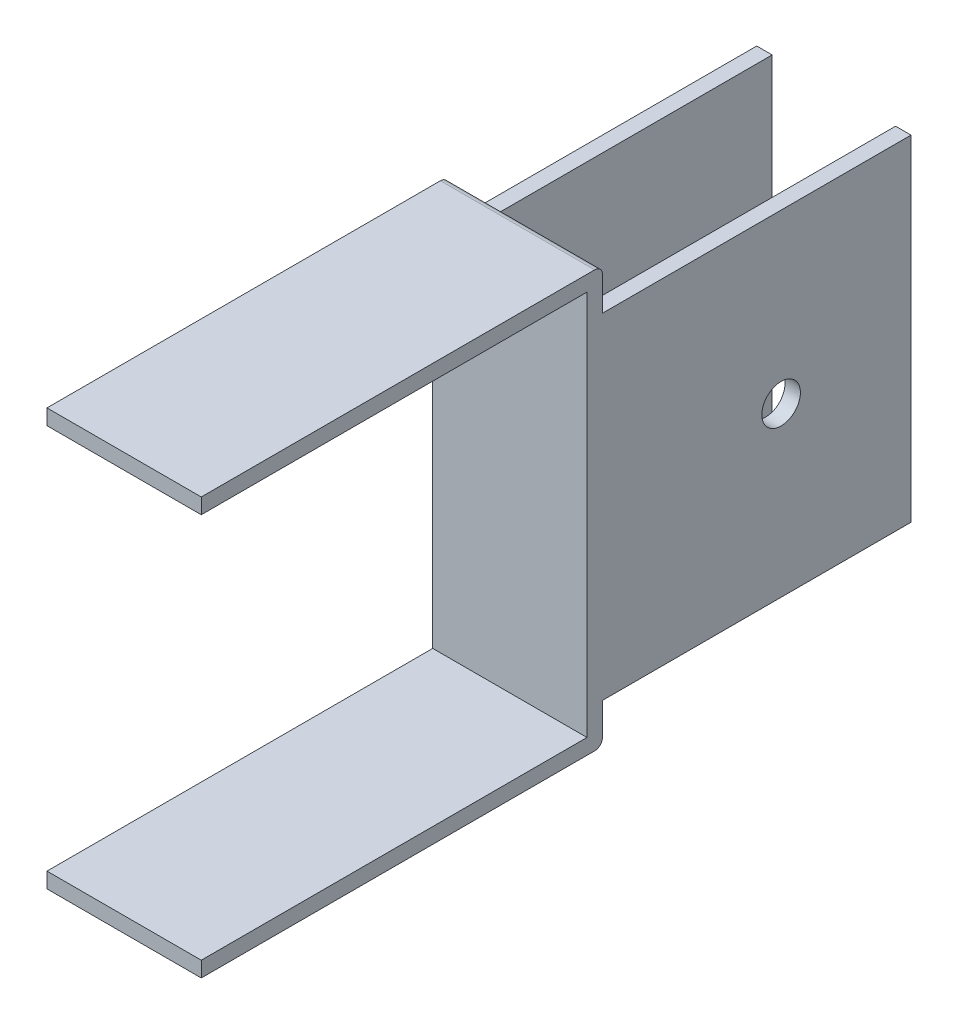
ISO-10303-21;
HEADER;
FILE_DESCRIPTION(('STEP AP214'),'2;1');
FILE_NAME('part.step','',(''),(''),'','','');
FILE_SCHEMA(('AUTOMOTIVE_DESIGN { 1 0 10303 214 1 1 1 1 }'));
ENDSEC;
DATA;
#1=APPLICATION_CONTEXT('core data for automotive mechanical design processes');
#2=APPLICATION_PROTOCOL_DEFINITION('international standard','automotive_design',2000,#1);
#3=PRODUCT_CONTEXT('',#1,'mechanical');
#4=PRODUCT('Part','Part','',(#3));
#5=PRODUCT_RELATED_PRODUCT_CATEGORY('part','',(#4));
#6=PRODUCT_DEFINITION_FORMATION('','',#4);
#7=PRODUCT_DEFINITION_CONTEXT('part definition',#1,'design');
#8=PRODUCT_DEFINITION('design','',#6,#7);
#9=PRODUCT_DEFINITION_SHAPE('','',#8);
#10=(LENGTH_UNIT() NAMED_UNIT(*) SI_UNIT(.MILLI.,.METRE.));
#11=(NAMED_UNIT(*) PLANE_ANGLE_UNIT() SI_UNIT($,.RADIAN.));
#12=(NAMED_UNIT(*) SI_UNIT($,.STERADIAN.) SOLID_ANGLE_UNIT());
#13=UNCERTAINTY_MEASURE_WITH_UNIT(LENGTH_MEASURE(1.E-05),#10,'distance_accuracy_value','');
#14=(GEOMETRIC_REPRESENTATION_CONTEXT(3) GLOBAL_UNCERTAINTY_ASSIGNED_CONTEXT((#13)) GLOBAL_UNIT_ASSIGNED_CONTEXT((#10,
#11,#12)) REPRESENTATION_CONTEXT('',''));
#15=CARTESIAN_POINT('',(0.,0.,0.));
#16=DIRECTION('',(0.,0.,1.));
#17=DIRECTION('',(1.,0.,0.));
#18=AXIS2_PLACEMENT_3D('',#15,#16,#17);
#19=CARTESIAN_POINT('',(0.,0.,0.));
#20=DIRECTION('',(0.,0.,-1.));
#21=DIRECTION('',(-1.,0.,0.));
#22=AXIS2_PLACEMENT_3D('',#19,#20,#21);
#23=PLANE('',#22);
#24=DIRECTION('',(0.,-1.,0.));
#25=VECTOR('',#24,1.);
#26=CARTESIAN_POINT('',(2.,48.6245249839503,0.));
#27=LINE('',#26,#25);
#28=CARTESIAN_POINT('',(2.,48.6245249839503,0.));
#29=VERTEX_POINT('',#28);
#30=CARTESIAN_POINT('',(1.99999999999999,5.15759567112359,0.));
#31=VERTEX_POINT('',#30);
#32=EDGE_CURVE('E424',#29,#31,#27,.T.);
#33=ORIENTED_EDGE('',*,*,#32,.F.);
#34=DIRECTION('',(1.,0.,0.));
#35=VECTOR('',#34,1.);
#36=CARTESIAN_POINT('',(0.,48.6245249839503,0.));
#37=LINE('',#36,#35);
#38=CARTESIAN_POINT('',(0.,48.6245249839503,0.));
#39=VERTEX_POINT('',#38);
#40=EDGE_CURVE('E421',#39,#29,#37,.T.);
#41=ORIENTED_EDGE('',*,*,#40,.F.);
#42=DIRECTION('',(0.,-1.,0.));
#43=VECTOR('',#42,1.);
#44=CARTESIAN_POINT('',(0.,0.,0.));
#45=LINE('',#44,#43);
#46=CARTESIAN_POINT('',(0.,53.,0.));
#47=VERTEX_POINT('',#46);
#48=EDGE_CURVE('E181',#47,#39,#45,.T.);
#49=ORIENTED_EDGE('',*,*,#48,.F.);
#50=DIRECTION('',(-1.,0.,0.));
#51=VECTOR('',#50,1.);
#52=CARTESIAN_POINT('',(20.,53.,0.));
#53=LINE('',#52,#51);
#54=CARTESIAN_POINT('',(20.,53.,0.));
#55=VERTEX_POINT('',#54);
#56=EDGE_CURVE('E292',#47,#55,#53,.F.);
#57=ORIENTED_EDGE('',*,*,#56,.T.);
#58=DIRECTION('',(0.,1.,0.));
#59=VECTOR('',#58,1.);
#60=CARTESIAN_POINT('',(20.,0.,0.));
#61=LINE('',#60,#59);
#62=CARTESIAN_POINT('',(20.,48.6245249839503,0.));
#63=VERTEX_POINT('',#62);
#64=EDGE_CURVE('E271',#63,#55,#61,.T.);
#65=ORIENTED_EDGE('',*,*,#64,.F.);
#66=DIRECTION('',(1.,0.,0.));
#67=VECTOR('',#66,1.);
#68=CARTESIAN_POINT('',(20.,48.6245249839503,0.));
#69=LINE('',#68,#67);
#70=CARTESIAN_POINT('',(18.,48.6245249839503,0.));
#71=VERTEX_POINT('',#70);
#72=EDGE_CURVE('E194',#71,#63,#69,.T.);
#73=ORIENTED_EDGE('',*,*,#72,.F.);
#74=DIRECTION('',(0.,1.,0.));
#75=VECTOR('',#74,1.);
#76=CARTESIAN_POINT('',(18.,48.6245249839503,0.));
#77=LINE('',#76,#75);
#78=CARTESIAN_POINT('',(18.,5.15759567112359,0.));
#79=VERTEX_POINT('',#78);
#80=EDGE_CURVE('E184',#79,#71,#77,.T.);
#81=ORIENTED_EDGE('',*,*,#80,.F.);
#82=DIRECTION('',(-1.,0.,0.));
#83=VECTOR('',#82,1.);
#84=CARTESIAN_POINT('',(20.,5.15759567112359,0.));
#85=LINE('',#84,#83);
#86=CARTESIAN_POINT('',(20.,5.15759567112359,0.));
#87=VERTEX_POINT('',#86);
#88=EDGE_CURVE('E182',#87,#79,#85,.T.);
#89=ORIENTED_EDGE('',*,*,#88,.F.);
#90=CARTESIAN_POINT('',(20.,1.,0.));
#91=VERTEX_POINT('',#90);
#92=EDGE_CURVE('E272',#91,#87,#61,.T.);
#93=ORIENTED_EDGE('',*,*,#92,.F.);
#94=DIRECTION('',(1.,0.,0.));
#95=VECTOR('',#94,1.);
#96=CARTESIAN_POINT('',(0.,1.,0.));
#97=LINE('',#96,#95);
#98=CARTESIAN_POINT('',(0.,1.,0.));
#99=VERTEX_POINT('',#98);
#100=EDGE_CURVE('E297',#91,#99,#97,.F.);
#101=ORIENTED_EDGE('',*,*,#100,.T.);
#102=CARTESIAN_POINT('',(0.,5.15759567112359,0.));
#103=VERTEX_POINT('',#102);
#104=EDGE_CURVE('E260',#103,#99,#45,.T.);
#105=ORIENTED_EDGE('',*,*,#104,.F.);
#106=DIRECTION('',(-1.,0.,0.));
#107=VECTOR('',#106,1.);
#108=CARTESIAN_POINT('',(0.,5.15759567112359,0.));
#109=LINE('',#108,#107);
#110=EDGE_CURVE('E176',#31,#103,#109,.T.);
#111=ORIENTED_EDGE('',*,*,#110,.F.);
#112=EDGE_LOOP('',(#33,#41,#49,#57,#65,#73,#81,#89,#93,#101,#105,#111));
#113=FACE_BOUND('',#112,.T.);
#114=ADVANCED_FACE('F33',(#113),#23,.T.);
#115=CARTESIAN_POINT('',(0.,0.,2.));
#116=DIRECTION('',(0.,0.,-1.));
#117=DIRECTION('',(-1.,0.,0.));
#118=AXIS2_PLACEMENT_3D('',#115,#116,#117);
#119=PLANE('',#118);
#120=DIRECTION('',(-1.,0.,0.));
#121=VECTOR('',#120,1.);
#122=CARTESIAN_POINT('',(0.,2.,2.));
#123=LINE('',#122,#121);
#124=CARTESIAN_POINT('',(20.,2.,2.));
#125=VERTEX_POINT('',#124);
#126=CARTESIAN_POINT('',(0.,2.,2.));
#127=VERTEX_POINT('',#126);
#128=EDGE_CURVE('E211',#125,#127,#123,.T.);
#129=ORIENTED_EDGE('',*,*,#128,.F.);
#130=DIRECTION('',(0.,1.,0.));
#131=VECTOR('',#130,1.);
#132=CARTESIAN_POINT('',(20.,0.,2.));
#133=LINE('',#132,#131);
#134=CARTESIAN_POINT('',(20.,52.,2.));
#135=VERTEX_POINT('',#134);
#136=EDGE_CURVE('E263',#125,#135,#133,.T.);
#137=ORIENTED_EDGE('',*,*,#136,.T.);
#138=DIRECTION('',(1.,0.,0.));
#139=VECTOR('',#138,1.);
#140=CARTESIAN_POINT('',(0.,52.,2.));
#141=LINE('',#140,#139);
#142=CARTESIAN_POINT('',(0.,52.,2.));
#143=VERTEX_POINT('',#142);
#144=EDGE_CURVE('E230',#143,#135,#141,.T.);
#145=ORIENTED_EDGE('',*,*,#144,.F.);
#146=DIRECTION('',(0.,-1.,0.));
#147=VECTOR('',#146,1.);
#148=CARTESIAN_POINT('',(0.,0.,2.));
#149=LINE('',#148,#147);
#150=EDGE_CURVE('E251',#143,#127,#149,.T.);
#151=ORIENTED_EDGE('',*,*,#150,.T.);
#152=EDGE_LOOP('',(#129,#137,#145,#151));
#153=FACE_BOUND('',#152,.T.);
#154=ADVANCED_FACE('F346',(#153),#119,.F.);
#155=CARTESIAN_POINT('',(0.,0.,2.));
#156=DIRECTION('',(1.,0.,0.));
#157=DIRECTION('',(0.,0.,-1.));
#158=AXIS2_PLACEMENT_3D('',#155,#156,#157);
#159=PLANE('',#158);
#160=CARTESIAN_POINT('',(0.,26.8910603275369,-23.1606094293184));
#161=DIRECTION('',(1.,0.,0.));
#162=DIRECTION('',(0.,0.,-1.));
#163=AXIS2_PLACEMENT_3D('',#160,#161,#162);
#164=CIRCLE('',#163,2.5);
#165=CARTESIAN_POINT('',(0.,26.8910603275369,-25.6606094293184));
#166=VERTEX_POINT('',#165);
#167=EDGE_CURVE('E420',#166,#166,#164,.T.);
#168=ORIENTED_EDGE('',*,*,#167,.T.);
#169=EDGE_LOOP('',(#168));
#170=FACE_BOUND('',#169,.T.);
#171=ORIENTED_EDGE('',*,*,#48,.T.);
#172=DIRECTION('',(0.,0.,1.));
#173=VECTOR('',#172,1.);
#174=CARTESIAN_POINT('',(0.,48.6245249839503,-40.));
#175=LINE('',#174,#173);
#176=CARTESIAN_POINT('',(0.,48.6245249839503,-40.));
#177=VERTEX_POINT('',#176);
#178=EDGE_CURVE('E164',#177,#39,#175,.T.);
#179=ORIENTED_EDGE('',*,*,#178,.F.);
#180=DIRECTION('',(0.,1.,0.));
#181=VECTOR('',#180,1.);
#182=CARTESIAN_POINT('',(0.,48.6245249839503,-40.));
#183=LINE('',#182,#181);
#184=CARTESIAN_POINT('',(0.,5.15759567112359,-40.));
#185=VERTEX_POINT('',#184);
#186=EDGE_CURVE('E171',#185,#177,#183,.T.);
#187=ORIENTED_EDGE('',*,*,#186,.F.);
#188=DIRECTION('',(0.,0.,1.));
#189=VECTOR('',#188,1.);
#190=CARTESIAN_POINT('',(0.,5.15759567112359,-40.));
#191=LINE('',#190,#189);
#192=EDGE_CURVE('E49',#185,#103,#191,.T.);
#193=ORIENTED_EDGE('',*,*,#192,.T.);
#194=ORIENTED_EDGE('',*,*,#104,.T.);
#195=CARTESIAN_POINT('',(0.,1.,1.));
#196=DIRECTION('',(1.,0.,0.));
#197=DIRECTION('',(0.,0.,-1.));
#198=AXIS2_PLACEMENT_3D('',#195,#196,#197);
#199=CIRCLE('',#198,1.);
#200=CARTESIAN_POINT('',(0.,0.,1.));
#201=VERTEX_POINT('',#200);
#202=EDGE_CURVE('E42',#99,#201,#199,.F.);
#203=ORIENTED_EDGE('',*,*,#202,.T.);
#204=DIRECTION('',(0.,0.,-1.));
#205=VECTOR('',#204,1.);
#206=CARTESIAN_POINT('',(0.,0.,2.));
#207=LINE('',#206,#205);
#208=CARTESIAN_POINT('',(0.,0.,52.));
#209=VERTEX_POINT('',#208);
#210=EDGE_CURVE('E282',#209,#201,#207,.T.);
#211=ORIENTED_EDGE('',*,*,#210,.F.);
#212=DIRECTION('',(0.,-1.,0.));
#213=VECTOR('',#212,1.);
#214=CARTESIAN_POINT('',(0.,0.,52.));
#215=LINE('',#214,#213);
#216=CARTESIAN_POINT('',(0.,2.,52.));
#217=VERTEX_POINT('',#216);
#218=EDGE_CURVE('E212',#217,#209,#215,.T.);
#219=ORIENTED_EDGE('',*,*,#218,.F.);
#220=DIRECTION('',(0.,0.,-1.));
#221=VECTOR('',#220,1.);
#222=CARTESIAN_POINT('',(0.,2.,52.));
#223=LINE('',#222,#221);
#224=EDGE_CURVE('E222',#217,#127,#223,.T.);
#225=ORIENTED_EDGE('',*,*,#224,.T.);
#226=ORIENTED_EDGE('',*,*,#150,.F.);
#227=DIRECTION('',(0.,0.,-1.));
#228=VECTOR('',#227,1.);
#229=CARTESIAN_POINT('',(0.,52.,52.));
#230=LINE('',#229,#228);
#231=CARTESIAN_POINT('',(0.,52.,52.));
#232=VERTEX_POINT('',#231);
#233=EDGE_CURVE('E255',#232,#143,#230,.T.);
#234=ORIENTED_EDGE('',*,*,#233,.F.);
#235=DIRECTION('',(0.,-1.,0.));
#236=VECTOR('',#235,1.);
#237=CARTESIAN_POINT('',(0.,54.,52.));
#238=LINE('',#237,#236);
#239=CARTESIAN_POINT('',(0.,54.,52.));
#240=VERTEX_POINT('',#239);
#241=EDGE_CURVE('E231',#240,#232,#238,.T.);
#242=ORIENTED_EDGE('',*,*,#241,.F.);
#243=DIRECTION('',(0.,0.,-1.));
#244=VECTOR('',#243,1.);
#245=CARTESIAN_POINT('',(0.,54.,2.));
#246=LINE('',#245,#244);
#247=CARTESIAN_POINT('',(0.,54.,1.));
#248=VERTEX_POINT('',#247);
#249=EDGE_CURVE('E265',#240,#248,#246,.T.);
#250=ORIENTED_EDGE('',*,*,#249,.T.);
#251=CARTESIAN_POINT('',(0.,53.,1.));
#252=DIRECTION('',(1.,0.,0.));
#253=DIRECTION('',(0.,0.,-1.));
#254=AXIS2_PLACEMENT_3D('',#251,#252,#253);
#255=CIRCLE('',#254,1.);
#256=EDGE_CURVE('E300',#248,#47,#255,.F.);
#257=ORIENTED_EDGE('',*,*,#256,.T.);
#258=EDGE_LOOP('',(#171,#179,#187,#193,#194,#203,#211,#219,#225,#226,#234,#242,#250,#257));
#259=FACE_BOUND('',#258,.T.);
#260=ADVANCED_FACE('F179',(#170,#259),#159,.F.);
#261=CARTESIAN_POINT('',(0.,0.,2.));
#262=DIRECTION('',(0.,1.,0.));
#263=DIRECTION('',(0.,0.,1.));
#264=AXIS2_PLACEMENT_3D('',#261,#262,#263);
#265=PLANE('',#264);
#266=ORIENTED_EDGE('',*,*,#210,.T.);
#267=DIRECTION('',(1.,0.,0.));
#268=VECTOR('',#267,1.);
#269=CARTESIAN_POINT('',(20.,0.,1.));
#270=LINE('',#269,#268);
#271=CARTESIAN_POINT('',(20.,0.,1.));
#272=VERTEX_POINT('',#271);
#273=EDGE_CURVE('E266',#201,#272,#270,.T.);
#274=ORIENTED_EDGE('',*,*,#273,.T.);
#275=DIRECTION('',(0.,0.,-1.));
#276=VECTOR('',#275,1.);
#277=CARTESIAN_POINT('',(20.,0.,2.));
#278=LINE('',#277,#276);
#279=CARTESIAN_POINT('',(20.,0.,52.));
#280=VERTEX_POINT('',#279);
#281=EDGE_CURVE('E280',#280,#272,#278,.T.);
#282=ORIENTED_EDGE('',*,*,#281,.F.);
#283=DIRECTION('',(1.,0.,0.));
#284=VECTOR('',#283,1.);
#285=CARTESIAN_POINT('',(0.,0.,52.));
#286=LINE('',#285,#284);
#287=EDGE_CURVE('E215',#209,#280,#286,.T.);
#288=ORIENTED_EDGE('',*,*,#287,.F.);
#289=EDGE_LOOP('',(#266,#274,#282,#288));
#290=FACE_BOUND('',#289,.T.);
#291=ADVANCED_FACE('F353',(#290),#265,.F.);
#292=CARTESIAN_POINT('',(20.,0.,2.));
#293=DIRECTION('',(-1.,0.,0.));
#294=DIRECTION('',(0.,0.,1.));
#295=AXIS2_PLACEMENT_3D('',#292,#293,#294);
#296=PLANE('',#295);
#297=CARTESIAN_POINT('',(20.,26.8910603275369,-23.1606094293184));
#298=DIRECTION('',(1.,0.,0.));
#299=DIRECTION('',(0.,0.,-1.));
#300=AXIS2_PLACEMENT_3D('',#297,#298,#299);
#301=CIRCLE('',#300,2.5);
#302=CARTESIAN_POINT('',(20.,26.8910603275369,-25.6606094293184));
#303=VERTEX_POINT('',#302);
#304=EDGE_CURVE('E438',#303,#303,#301,.T.);
#305=ORIENTED_EDGE('',*,*,#304,.F.);
#306=EDGE_LOOP('',(#305));
#307=FACE_BOUND('',#306,.T.);
#308=ORIENTED_EDGE('',*,*,#281,.T.);
#309=CARTESIAN_POINT('',(20.,1.,1.));
#310=DIRECTION('',(-1.,0.,0.));
#311=DIRECTION('',(0.,0.,1.));
#312=AXIS2_PLACEMENT_3D('',#309,#310,#311);
#313=CIRCLE('',#312,1.);
#314=EDGE_CURVE('E289',#272,#91,#313,.F.);
#315=ORIENTED_EDGE('',*,*,#314,.T.);
#316=ORIENTED_EDGE('',*,*,#92,.T.);
#317=DIRECTION('',(0.,0.,1.));
#318=VECTOR('',#317,1.);
#319=CARTESIAN_POINT('',(20.,5.15759567112359,-40.));
#320=LINE('',#319,#318);
#321=CARTESIAN_POINT('',(20.,5.15759567112359,-40.));
#322=VERTEX_POINT('',#321);
#323=EDGE_CURVE('E209',#322,#87,#320,.T.);
#324=ORIENTED_EDGE('',*,*,#323,.F.);
#325=DIRECTION('',(0.,-1.,0.));
#326=VECTOR('',#325,1.);
#327=CARTESIAN_POINT('',(20.,48.6245249839503,-40.));
#328=LINE('',#327,#326);
#329=CARTESIAN_POINT('',(20.,48.6245249839503,-40.));
#330=VERTEX_POINT('',#329);
#331=EDGE_CURVE('E190',#330,#322,#328,.T.);
#332=ORIENTED_EDGE('',*,*,#331,.F.);
#333=DIRECTION('',(0.,0.,1.));
#334=VECTOR('',#333,1.);
#335=CARTESIAN_POINT('',(20.,48.6245249839503,-40.));
#336=LINE('',#335,#334);
#337=EDGE_CURVE('E199',#330,#63,#336,.T.);
#338=ORIENTED_EDGE('',*,*,#337,.T.);
#339=ORIENTED_EDGE('',*,*,#64,.T.);
#340=CARTESIAN_POINT('',(20.,53.,1.));
#341=DIRECTION('',(-1.,0.,0.));
#342=DIRECTION('',(0.,0.,1.));
#343=AXIS2_PLACEMENT_3D('',#340,#341,#342);
#344=CIRCLE('',#343,1.);
#345=CARTESIAN_POINT('',(20.,54.,1.));
#346=VERTEX_POINT('',#345);
#347=EDGE_CURVE('E288',#55,#346,#344,.F.);
#348=ORIENTED_EDGE('',*,*,#347,.T.);
#349=DIRECTION('',(0.,0.,-1.));
#350=VECTOR('',#349,1.);
#351=CARTESIAN_POINT('',(20.,54.,2.));
#352=LINE('',#351,#350);
#353=CARTESIAN_POINT('',(20.,54.,52.));
#354=VERTEX_POINT('',#353);
#355=EDGE_CURVE('E277',#354,#346,#352,.T.);
#356=ORIENTED_EDGE('',*,*,#355,.F.);
#357=DIRECTION('',(0.,1.,0.));
#358=VECTOR('',#357,1.);
#359=CARTESIAN_POINT('',(20.,54.,52.));
#360=LINE('',#359,#358);
#361=CARTESIAN_POINT('',(20.,52.,52.));
#362=VERTEX_POINT('',#361);
#363=EDGE_CURVE('E236',#362,#354,#360,.T.);
#364=ORIENTED_EDGE('',*,*,#363,.F.);
#365=DIRECTION('',(0.,0.,-1.));
#366=VECTOR('',#365,1.);
#367=CARTESIAN_POINT('',(20.,52.,52.));
#368=LINE('',#367,#366);
#369=EDGE_CURVE('E242',#362,#135,#368,.T.);
#370=ORIENTED_EDGE('',*,*,#369,.T.);
#371=ORIENTED_EDGE('',*,*,#136,.F.);
#372=DIRECTION('',(0.,0.,-1.));
#373=VECTOR('',#372,1.);
#374=CARTESIAN_POINT('',(20.,2.,52.));
#375=LINE('',#374,#373);
#376=CARTESIAN_POINT('',(20.,2.,52.));
#377=VERTEX_POINT('',#376);
#378=EDGE_CURVE('E227',#377,#125,#375,.T.);
#379=ORIENTED_EDGE('',*,*,#378,.F.);
#380=DIRECTION('',(0.,1.,0.));
#381=VECTOR('',#380,1.);
#382=CARTESIAN_POINT('',(20.,0.,52.));
#383=LINE('',#382,#381);
#384=EDGE_CURVE('E218',#280,#377,#383,.T.);
#385=ORIENTED_EDGE('',*,*,#384,.F.);
#386=EDGE_LOOP('',(#308,#315,#316,#324,#332,#338,#339,#348,#356,#364,#370,#371,#379,#385));
#387=FACE_BOUND('',#386,.T.);
#388=ADVANCED_FACE('F309',(#307,#387),#296,.F.);
#389=CARTESIAN_POINT('',(0.,54.,2.));
#390=DIRECTION('',(0.,-1.,0.));
#391=DIRECTION('',(0.,0.,-1.));
#392=AXIS2_PLACEMENT_3D('',#389,#390,#391);
#393=PLANE('',#392);
#394=ORIENTED_EDGE('',*,*,#355,.T.);
#395=DIRECTION('',(-1.,0.,0.));
#396=VECTOR('',#395,1.);
#397=CARTESIAN_POINT('',(0.,54.,1.));
#398=LINE('',#397,#396);
#399=EDGE_CURVE('E11',#346,#248,#398,.T.);
#400=ORIENTED_EDGE('',*,*,#399,.T.);
#401=ORIENTED_EDGE('',*,*,#249,.F.);
#402=DIRECTION('',(-1.,0.,0.));
#403=VECTOR('',#402,1.);
#404=CARTESIAN_POINT('',(0.,54.,52.));
#405=LINE('',#404,#403);
#406=EDGE_CURVE('E239',#354,#240,#405,.T.);
#407=ORIENTED_EDGE('',*,*,#406,.F.);
#408=EDGE_LOOP('',(#394,#400,#401,#407));
#409=FACE_BOUND('',#408,.T.);
#410=ADVANCED_FACE('F332',(#409),#393,.F.);
#411=CARTESIAN_POINT('',(0.,52.,52.));
#412=DIRECTION('',(0.,1.,0.));
#413=DIRECTION('',(0.,0.,1.));
#414=AXIS2_PLACEMENT_3D('',#411,#412,#413);
#415=PLANE('',#414);
#416=ORIENTED_EDGE('',*,*,#144,.T.);
#417=ORIENTED_EDGE('',*,*,#369,.F.);
#418=DIRECTION('',(1.,0.,0.));
#419=VECTOR('',#418,1.);
#420=CARTESIAN_POINT('',(0.,52.,52.));
#421=LINE('',#420,#419);
#422=EDGE_CURVE('E234',#232,#362,#421,.T.);
#423=ORIENTED_EDGE('',*,*,#422,.F.);
#424=ORIENTED_EDGE('',*,*,#233,.T.);
#425=EDGE_LOOP('',(#416,#417,#423,#424));
#426=FACE_BOUND('',#425,.T.);
#427=ADVANCED_FACE('F344',(#426),#415,.F.);
#428=CARTESIAN_POINT('',(0.,0.,52.));
#429=DIRECTION('',(0.,0.,1.));
#430=DIRECTION('',(1.,0.,0.));
#431=AXIS2_PLACEMENT_3D('',#428,#429,#430);
#432=PLANE('',#431);
#433=ORIENTED_EDGE('',*,*,#241,.T.);
#434=ORIENTED_EDGE('',*,*,#422,.T.);
#435=ORIENTED_EDGE('',*,*,#363,.T.);
#436=ORIENTED_EDGE('',*,*,#406,.T.);
#437=EDGE_LOOP('',(#433,#434,#435,#436));
#438=FACE_BOUND('',#437,.T.);
#439=ADVANCED_FACE('F338',(#438),#432,.T.);
#440=CARTESIAN_POINT('',(0.,2.,52.));
#441=DIRECTION('',(0.,-1.,0.));
#442=DIRECTION('',(0.,0.,-1.));
#443=AXIS2_PLACEMENT_3D('',#440,#441,#442);
#444=PLANE('',#443);
#445=ORIENTED_EDGE('',*,*,#128,.T.);
#446=ORIENTED_EDGE('',*,*,#224,.F.);
#447=DIRECTION('',(-1.,0.,0.));
#448=VECTOR('',#447,1.);
#449=CARTESIAN_POINT('',(0.,2.,52.));
#450=LINE('',#449,#448);
#451=EDGE_CURVE('E220',#377,#217,#450,.T.);
#452=ORIENTED_EDGE('',*,*,#451,.F.);
#453=ORIENTED_EDGE('',*,*,#378,.T.);
#454=EDGE_LOOP('',(#445,#446,#452,#453));
#455=FACE_BOUND('',#454,.T.);
#456=ADVANCED_FACE('F350',(#455),#444,.F.);
#457=CARTESIAN_POINT('',(0.,0.,52.));
#458=DIRECTION('',(0.,0.,-1.));
#459=DIRECTION('',(-1.,0.,0.));
#460=AXIS2_PLACEMENT_3D('',#457,#458,#459);
#461=PLANE('',#460);
#462=ORIENTED_EDGE('',*,*,#218,.T.);
#463=ORIENTED_EDGE('',*,*,#287,.T.);
#464=ORIENTED_EDGE('',*,*,#384,.T.);
#465=ORIENTED_EDGE('',*,*,#451,.T.);
#466=EDGE_LOOP('',(#462,#463,#464,#465));
#467=FACE_BOUND('',#466,.T.);
#468=ADVANCED_FACE('F352',(#467),#461,.F.);
#469=CARTESIAN_POINT('',(0.,1.,1.));
#470=DIRECTION('',(-1.,0.,0.));
#471=DIRECTION('',(0.,0.,1.));
#472=AXIS2_PLACEMENT_3D('',#469,#470,#471);
#473=CYLINDRICAL_SURFACE('',#472,1.);
#474=ORIENTED_EDGE('',*,*,#202,.F.);
#475=ORIENTED_EDGE('',*,*,#100,.F.);
#476=ORIENTED_EDGE('',*,*,#314,.F.);
#477=ORIENTED_EDGE('',*,*,#273,.F.);
#478=EDGE_LOOP('',(#474,#475,#476,#477));
#479=FACE_BOUND('',#478,.T.);
#480=ADVANCED_FACE('F307',(#479),#473,.T.);
#481=CARTESIAN_POINT('',(0.,53.,1.));
#482=DIRECTION('',(1.,0.,0.));
#483=DIRECTION('',(0.,0.,-1.));
#484=AXIS2_PLACEMENT_3D('',#481,#482,#483);
#485=CYLINDRICAL_SURFACE('',#484,1.);
#486=ORIENTED_EDGE('',*,*,#347,.F.);
#487=ORIENTED_EDGE('',*,*,#56,.F.);
#488=ORIENTED_EDGE('',*,*,#256,.F.);
#489=ORIENTED_EDGE('',*,*,#399,.F.);
#490=EDGE_LOOP('',(#486,#487,#488,#489));
#491=FACE_BOUND('',#490,.T.);
#492=ADVANCED_FACE('F35',(#491),#485,.T.);
#493=CARTESIAN_POINT('',(20.,5.15759567112359,-40.));
#494=DIRECTION('',(0.,1.,0.));
#495=DIRECTION('',(0.,0.,1.));
#496=AXIS2_PLACEMENT_3D('',#493,#494,#495);
#497=PLANE('',#496);
#498=ORIENTED_EDGE('',*,*,#88,.T.);
#499=DIRECTION('',(0.,0.,1.));
#500=VECTOR('',#499,1.);
#501=CARTESIAN_POINT('',(18.,5.15759567112359,-40.));
#502=LINE('',#501,#500);
#503=CARTESIAN_POINT('',(18.,5.15759567112359,-40.));
#504=VERTEX_POINT('',#503);
#505=EDGE_CURVE('E206',#504,#79,#502,.T.);
#506=ORIENTED_EDGE('',*,*,#505,.F.);
#507=DIRECTION('',(-1.,0.,0.));
#508=VECTOR('',#507,1.);
#509=CARTESIAN_POINT('',(20.,5.15759567112359,-40.));
#510=LINE('',#509,#508);
#511=EDGE_CURVE('E193',#322,#504,#510,.T.);
#512=ORIENTED_EDGE('',*,*,#511,.F.);
#513=ORIENTED_EDGE('',*,*,#323,.T.);
#514=EDGE_LOOP('',(#498,#506,#512,#513));
#515=FACE_BOUND('',#514,.T.);
#516=ADVANCED_FACE('F319',(#515),#497,.F.);
#517=CARTESIAN_POINT('',(18.,48.6245249839503,-40.));
#518=DIRECTION('',(1.,0.,0.));
#519=DIRECTION('',(0.,1.,0.));
#520=AXIS2_PLACEMENT_3D('',#517,#518,#519);
#521=PLANE('',#520);
#522=CARTESIAN_POINT('',(18.,26.8910603275369,-23.1606094293184));
#523=DIRECTION('',(1.,0.,0.));
#524=DIRECTION('',(0.,1.,0.));
#525=AXIS2_PLACEMENT_3D('',#522,#523,#524);
#526=CIRCLE('',#525,2.5);
#527=CARTESIAN_POINT('',(18.,29.3910603275369,-23.1606094293184));
#528=VERTEX_POINT('',#527);
#529=EDGE_CURVE('E422',#528,#528,#526,.T.);
#530=ORIENTED_EDGE('',*,*,#529,.T.);
#531=EDGE_LOOP('',(#530));
#532=FACE_BOUND('',#531,.T.);
#533=ORIENTED_EDGE('',*,*,#80,.T.);
#534=DIRECTION('',(0.,0.,1.));
#535=VECTOR('',#534,1.);
#536=CARTESIAN_POINT('',(18.,48.6245249839503,-40.));
#537=LINE('',#536,#535);
#538=CARTESIAN_POINT('',(18.,48.6245249839503,-40.));
#539=VERTEX_POINT('',#538);
#540=EDGE_CURVE('E57',#539,#71,#537,.T.);
#541=ORIENTED_EDGE('',*,*,#540,.F.);
#542=DIRECTION('',(0.,1.,0.));
#543=VECTOR('',#542,1.);
#544=CARTESIAN_POINT('',(18.,48.6245249839503,-40.));
#545=LINE('',#544,#543);
#546=EDGE_CURVE('E196',#504,#539,#545,.T.);
#547=ORIENTED_EDGE('',*,*,#546,.F.);
#548=ORIENTED_EDGE('',*,*,#505,.T.);
#549=EDGE_LOOP('',(#533,#541,#547,#548));
#550=FACE_BOUND('',#549,.T.);
#551=ADVANCED_FACE('F322',(#532,#550),#521,.F.);
#552=CARTESIAN_POINT('',(20.,48.6245249839503,-40.));
#553=DIRECTION('',(0.,-1.,0.));
#554=DIRECTION('',(0.,0.,-1.));
#555=AXIS2_PLACEMENT_3D('',#552,#553,#554);
#556=PLANE('',#555);
#557=ORIENTED_EDGE('',*,*,#72,.T.);
#558=ORIENTED_EDGE('',*,*,#337,.F.);
#559=DIRECTION('',(1.,0.,0.));
#560=VECTOR('',#559,1.);
#561=CARTESIAN_POINT('',(20.,48.6245249839503,-40.));
#562=LINE('',#561,#560);
#563=EDGE_CURVE('E198',#539,#330,#562,.T.);
#564=ORIENTED_EDGE('',*,*,#563,.F.);
#565=ORIENTED_EDGE('',*,*,#540,.T.);
#566=EDGE_LOOP('',(#557,#558,#564,#565));
#567=FACE_BOUND('',#566,.T.);
#568=ADVANCED_FACE('F389',(#567),#556,.F.);
#569=CARTESIAN_POINT('',(0.,0.,-40.));
#570=DIRECTION('',(0.,0.,-1.));
#571=DIRECTION('',(-1.,0.,0.));
#572=AXIS2_PLACEMENT_3D('',#569,#570,#571);
#573=PLANE('',#572);
#574=ORIENTED_EDGE('',*,*,#331,.T.);
#575=ORIENTED_EDGE('',*,*,#511,.T.);
#576=ORIENTED_EDGE('',*,*,#546,.T.);
#577=ORIENTED_EDGE('',*,*,#563,.T.);
#578=EDGE_LOOP('',(#574,#575,#576,#577));
#579=FACE_BOUND('',#578,.T.);
#580=ADVANCED_FACE('F324',(#579),#573,.T.);
#581=CARTESIAN_POINT('',(0.,48.6245249839503,-40.));
#582=DIRECTION('',(0.,-1.,0.));
#583=DIRECTION('',(0.,0.,-1.));
#584=AXIS2_PLACEMENT_3D('',#581,#582,#583);
#585=PLANE('',#584);
#586=ORIENTED_EDGE('',*,*,#40,.T.);
#587=DIRECTION('',(0.,0.,1.));
#588=VECTOR('',#587,1.);
#589=CARTESIAN_POINT('',(2.,48.6245249839503,-40.));
#590=LINE('',#589,#588);
#591=CARTESIAN_POINT('',(2.,48.6245249839503,-40.));
#592=VERTEX_POINT('',#591);
#593=EDGE_CURVE('E167',#592,#29,#590,.T.);
#594=ORIENTED_EDGE('',*,*,#593,.F.);
#595=DIRECTION('',(1.,0.,0.));
#596=VECTOR('',#595,1.);
#597=CARTESIAN_POINT('',(0.,48.6245249839503,-40.));
#598=LINE('',#597,#596);
#599=EDGE_CURVE('E160',#177,#592,#598,.T.);
#600=ORIENTED_EDGE('',*,*,#599,.F.);
#601=ORIENTED_EDGE('',*,*,#178,.T.);
#602=EDGE_LOOP('',(#586,#594,#600,#601));
#603=FACE_BOUND('',#602,.T.);
#604=ADVANCED_FACE('F162',(#603),#585,.F.);
#605=CARTESIAN_POINT('',(2.,48.6245249839503,-40.));
#606=DIRECTION('',(-1.,0.,0.));
#607=DIRECTION('',(0.,-1.,0.));
#608=AXIS2_PLACEMENT_3D('',#605,#606,#607);
#609=PLANE('',#608);
#610=CARTESIAN_POINT('',(2.,26.8910603275369,-23.1606094293184));
#611=DIRECTION('',(-1.,0.,0.));
#612=DIRECTION('',(0.,-1.,0.));
#613=AXIS2_PLACEMENT_3D('',#610,#611,#612);
#614=CIRCLE('',#613,2.5);
#615=CARTESIAN_POINT('',(2.,24.3910603275369,-23.1606094293184));
#616=VERTEX_POINT('',#615);
#617=EDGE_CURVE('E37',#616,#616,#614,.T.);
#618=ORIENTED_EDGE('',*,*,#617,.T.);
#619=EDGE_LOOP('',(#618));
#620=FACE_BOUND('',#619,.T.);
#621=ORIENTED_EDGE('',*,*,#32,.T.);
#622=DIRECTION('',(0.,0.,1.));
#623=VECTOR('',#622,1.);
#624=CARTESIAN_POINT('',(1.99999999999999,5.15759567112359,-40.));
#625=LINE('',#624,#623);
#626=CARTESIAN_POINT('',(1.99999999999999,5.15759567112359,-40.));
#627=VERTEX_POINT('',#626);
#628=EDGE_CURVE('E186',#627,#31,#625,.T.);
#629=ORIENTED_EDGE('',*,*,#628,.F.);
#630=DIRECTION('',(0.,-1.,0.));
#631=VECTOR('',#630,1.);
#632=CARTESIAN_POINT('',(2.,48.6245249839503,-40.));
#633=LINE('',#632,#631);
#634=EDGE_CURVE('E170',#592,#627,#633,.T.);
#635=ORIENTED_EDGE('',*,*,#634,.F.);
#636=ORIENTED_EDGE('',*,*,#593,.T.);
#637=EDGE_LOOP('',(#621,#629,#635,#636));
#638=FACE_BOUND('',#637,.T.);
#639=ADVANCED_FACE('F397',(#620,#638),#609,.F.);
#640=CARTESIAN_POINT('',(0.,5.15759567112359,-40.));
#641=DIRECTION('',(0.,1.,0.));
#642=DIRECTION('',(0.,0.,1.));
#643=AXIS2_PLACEMENT_3D('',#640,#641,#642);
#644=PLANE('',#643);
#645=ORIENTED_EDGE('',*,*,#110,.T.);
#646=ORIENTED_EDGE('',*,*,#192,.F.);
#647=DIRECTION('',(-1.,0.,0.));
#648=VECTOR('',#647,1.);
#649=CARTESIAN_POINT('',(0.,5.15759567112359,-40.));
#650=LINE('',#649,#648);
#651=EDGE_CURVE('E175',#627,#185,#650,.T.);
#652=ORIENTED_EDGE('',*,*,#651,.F.);
#653=ORIENTED_EDGE('',*,*,#628,.T.);
#654=EDGE_LOOP('',(#645,#646,#652,#653));
#655=FACE_BOUND('',#654,.T.);
#656=ADVANCED_FACE('F400',(#655),#644,.F.);
#657=CARTESIAN_POINT('',(0.,0.,-40.));
#658=DIRECTION('',(0.,0.,1.));
#659=DIRECTION('',(1.,0.,0.));
#660=AXIS2_PLACEMENT_3D('',#657,#658,#659);
#661=PLANE('',#660);
#662=ORIENTED_EDGE('',*,*,#186,.T.);
#663=ORIENTED_EDGE('',*,*,#599,.T.);
#664=ORIENTED_EDGE('',*,*,#634,.T.);
#665=ORIENTED_EDGE('',*,*,#651,.T.);
#666=EDGE_LOOP('',(#662,#663,#664,#665));
#667=FACE_BOUND('',#666,.T.);
#668=ADVANCED_FACE('F173',(#667),#661,.F.);
#669=CARTESIAN_POINT('',(-5.00000000014378E-05,26.8910603275369,-23.1606094293184));
#670=DIRECTION('',(1.,0.,0.));
#671=DIRECTION('',(0.,0.,-1.));
#672=AXIS2_PLACEMENT_3D('',#669,#670,#671);
#673=CYLINDRICAL_SURFACE('',#672,2.5);
#674=ORIENTED_EDGE('',*,*,#617,.F.);
#675=EDGE_LOOP('',(#674));
#676=FACE_BOUND('',#675,.T.);
#677=ORIENTED_EDGE('',*,*,#167,.F.);
#678=EDGE_LOOP('',(#677));
#679=FACE_BOUND('',#678,.T.);
#680=ADVANCED_FACE('F407',(#676,#679),#673,.F.);
#681=ORIENTED_EDGE('',*,*,#304,.T.);
#682=EDGE_LOOP('',(#681));
#683=FACE_BOUND('',#682,.T.);
#684=ORIENTED_EDGE('',*,*,#529,.F.);
#685=EDGE_LOOP('',(#684));
#686=FACE_BOUND('',#685,.T.);
#687=ADVANCED_FACE('F409',(#683,#686),#673,.F.);
#688=CLOSED_SHELL('',(#114,#154,#260,#291,#388,#410,#427,#439,#456,#468,#480,#492,#516,#551,
#568,#580,#604,#639,#656,#668,#680,#687));
#689=MANIFOLD_SOLID_BREP('B2',#688);
#690=ADVANCED_BREP_SHAPE_REPRESENTATION('',(#18,#689),#14);
#691=SHAPE_DEFINITION_REPRESENTATION(#9,#690);
ENDSEC;
END-ISO-10303-21;
